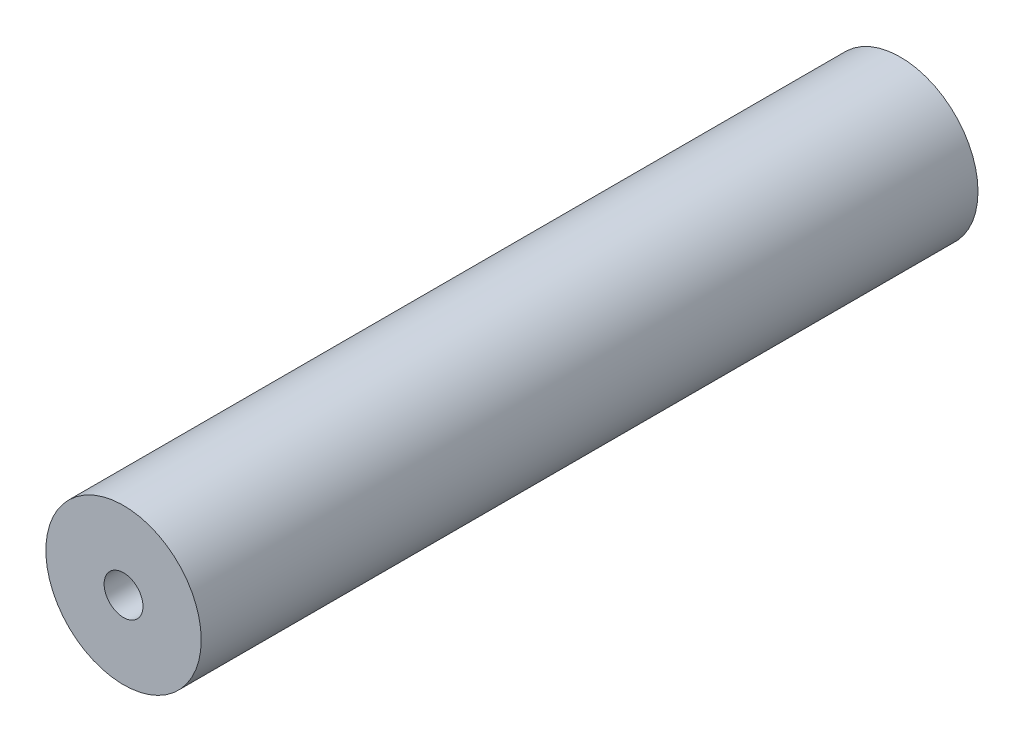
ISO-10303-21;
HEADER;
FILE_DESCRIPTION(('STEP AP214'),'2;1');
FILE_NAME('part.step','',(''),(''),'','','');
FILE_SCHEMA(('AUTOMOTIVE_DESIGN { 1 0 10303 214 1 1 1 1 }'));
ENDSEC;
DATA;
#1=APPLICATION_CONTEXT('core data for automotive mechanical design processes');
#2=APPLICATION_PROTOCOL_DEFINITION('international standard','automotive_design',2000,#1);
#3=PRODUCT_CONTEXT('',#1,'mechanical');
#4=PRODUCT('Part','Part','',(#3));
#5=PRODUCT_RELATED_PRODUCT_CATEGORY('part','',(#4));
#6=PRODUCT_DEFINITION_FORMATION('','',#4);
#7=PRODUCT_DEFINITION_CONTEXT('part definition',#1,'design');
#8=PRODUCT_DEFINITION('design','',#6,#7);
#9=PRODUCT_DEFINITION_SHAPE('','',#8);
#10=(LENGTH_UNIT() NAMED_UNIT(*) SI_UNIT(.MILLI.,.METRE.));
#11=(NAMED_UNIT(*) PLANE_ANGLE_UNIT() SI_UNIT($,.RADIAN.));
#12=(NAMED_UNIT(*) SI_UNIT($,.STERADIAN.) SOLID_ANGLE_UNIT());
#13=UNCERTAINTY_MEASURE_WITH_UNIT(LENGTH_MEASURE(1.E-05),#10,'distance_accuracy_value','');
#14=(GEOMETRIC_REPRESENTATION_CONTEXT(3) GLOBAL_UNCERTAINTY_ASSIGNED_CONTEXT((#13)) GLOBAL_UNIT_ASSIGNED_CONTEXT((#10,
#11,#12)) REPRESENTATION_CONTEXT('',''));
#15=CARTESIAN_POINT('',(0.,0.,0.));
#16=DIRECTION('',(0.,0.,1.));
#17=DIRECTION('',(1.,0.,0.));
#18=AXIS2_PLACEMENT_3D('',#15,#16,#17);
#19=CARTESIAN_POINT('',(0.,0.,200.));
#20=DIRECTION('',(0.,0.,-1.));
#21=DIRECTION('',(-1.,0.,0.));
#22=AXIS2_PLACEMENT_3D('',#19,#20,#21);
#23=CYLINDRICAL_SURFACE('',#22,40.);
#24=CARTESIAN_POINT('',(0.,0.,200.));
#25=DIRECTION('',(0.,0.,1.));
#26=DIRECTION('',(1.,0.,0.));
#27=AXIS2_PLACEMENT_3D('',#24,#25,#26);
#28=CIRCLE('',#27,40.);
#29=CARTESIAN_POINT('',(40.,0.,200.));
#30=VERTEX_POINT('',#29);
#31=EDGE_CURVE('E10',#30,#30,#28,.T.);
#32=ORIENTED_EDGE('',*,*,#31,.F.);
#33=EDGE_LOOP('',(#32));
#34=FACE_BOUND('',#33,.T.);
#35=CARTESIAN_POINT('',(0.,0.,-200.));
#36=DIRECTION('',(0.,0.,1.));
#37=DIRECTION('',(1.,0.,0.));
#38=AXIS2_PLACEMENT_3D('',#35,#36,#37);
#39=CIRCLE('',#38,40.);
#40=CARTESIAN_POINT('',(40.,0.,-200.));
#41=VERTEX_POINT('',#40);
#42=EDGE_CURVE('E40',#41,#41,#39,.T.);
#43=ORIENTED_EDGE('',*,*,#42,.T.);
#44=EDGE_LOOP('',(#43));
#45=FACE_BOUND('',#44,.T.);
#46=ADVANCED_FACE('F37',(#34,#45),#23,.T.);
#47=CARTESIAN_POINT('',(0.,0.,200.));
#48=DIRECTION('',(0.,0.,1.));
#49=DIRECTION('',(1.,0.,0.));
#50=AXIS2_PLACEMENT_3D('',#47,#48,#49);
#51=PLANE('',#50);
#52=CARTESIAN_POINT('',(0.,0.,200.));
#53=DIRECTION('',(0.,0.,1.));
#54=DIRECTION('',(1.,0.,0.));
#55=AXIS2_PLACEMENT_3D('',#52,#53,#54);
#56=CIRCLE('',#55,10.);
#57=CARTESIAN_POINT('',(10.,0.,200.));
#58=VERTEX_POINT('',#57);
#59=EDGE_CURVE('E51',#58,#58,#56,.T.);
#60=ORIENTED_EDGE('',*,*,#59,.F.);
#61=EDGE_LOOP('',(#60));
#62=FACE_BOUND('',#61,.T.);
#63=ORIENTED_EDGE('',*,*,#31,.T.);
#64=EDGE_LOOP('',(#63));
#65=FACE_BOUND('',#64,.T.);
#66=ADVANCED_FACE('F80',(#62,#65),#51,.T.);
#67=CARTESIAN_POINT('',(0.,0.,-200.));
#68=DIRECTION('',(0.,0.,1.));
#69=DIRECTION('',(1.,0.,0.));
#70=AXIS2_PLACEMENT_3D('',#67,#68,#69);
#71=PLANE('',#70);
#72=CARTESIAN_POINT('',(0.,0.,-200.));
#73=DIRECTION('',(0.,0.,-1.));
#74=DIRECTION('',(-1.,0.,0.));
#75=AXIS2_PLACEMENT_3D('',#72,#73,#74);
#76=CIRCLE('',#75,10.);
#77=CARTESIAN_POINT('',(-10.,0.,-200.));
#78=VERTEX_POINT('',#77);
#79=EDGE_CURVE('E59',#78,#78,#76,.T.);
#80=ORIENTED_EDGE('',*,*,#79,.F.);
#81=EDGE_LOOP('',(#80));
#82=FACE_BOUND('',#81,.T.);
#83=ORIENTED_EDGE('',*,*,#42,.F.);
#84=EDGE_LOOP('',(#83));
#85=FACE_BOUND('',#84,.T.);
#86=ADVANCED_FACE('F76',(#82,#85),#71,.F.);
#87=CARTESIAN_POINT('',(0.,0.,80.));
#88=DIRECTION('',(0.,0.,1.));
#89=DIRECTION('',(1.,0.,0.));
#90=AXIS2_PLACEMENT_3D('',#87,#88,#89);
#91=CYLINDRICAL_SURFACE('',#90,10.);
#92=CARTESIAN_POINT('',(0.,0.,80.));
#93=DIRECTION('',(0.,0.,1.));
#94=DIRECTION('',(1.,0.,0.));
#95=AXIS2_PLACEMENT_3D('',#92,#93,#94);
#96=CIRCLE('',#95,10.);
#97=CARTESIAN_POINT('',(10.,0.,80.));
#98=VERTEX_POINT('',#97);
#99=EDGE_CURVE('E49',#98,#98,#96,.T.);
#100=ORIENTED_EDGE('',*,*,#99,.F.);
#101=EDGE_LOOP('',(#100));
#102=FACE_BOUND('',#101,.T.);
#103=ORIENTED_EDGE('',*,*,#59,.T.);
#104=EDGE_LOOP('',(#103));
#105=FACE_BOUND('',#104,.T.);
#106=ADVANCED_FACE('F79',(#102,#105),#91,.F.);
#107=CARTESIAN_POINT('',(0.,0.,80.));
#108=DIRECTION('',(0.,0.,1.));
#109=DIRECTION('',(1.,0.,0.));
#110=AXIS2_PLACEMENT_3D('',#107,#108,#109);
#111=PLANE('',#110);
#112=ORIENTED_EDGE('',*,*,#99,.T.);
#113=EDGE_LOOP('',(#112));
#114=FACE_BOUND('',#113,.T.);
#115=ADVANCED_FACE('F72',(#114),#111,.T.);
#116=CARTESIAN_POINT('',(0.,0.,-80.));
#117=DIRECTION('',(0.,0.,-1.));
#118=DIRECTION('',(-1.,0.,0.));
#119=AXIS2_PLACEMENT_3D('',#116,#117,#118);
#120=CYLINDRICAL_SURFACE('',#119,10.);
#121=CARTESIAN_POINT('',(0.,0.,-80.));
#122=DIRECTION('',(0.,0.,-1.));
#123=DIRECTION('',(-1.,0.,0.));
#124=AXIS2_PLACEMENT_3D('',#121,#122,#123);
#125=CIRCLE('',#124,10.);
#126=CARTESIAN_POINT('',(-10.,0.,-80.));
#127=VERTEX_POINT('',#126);
#128=EDGE_CURVE('E55',#127,#127,#125,.T.);
#129=ORIENTED_EDGE('',*,*,#128,.F.);
#130=EDGE_LOOP('',(#129));
#131=FACE_BOUND('',#130,.T.);
#132=ORIENTED_EDGE('',*,*,#79,.T.);
#133=EDGE_LOOP('',(#132));
#134=FACE_BOUND('',#133,.T.);
#135=ADVANCED_FACE('F69',(#131,#134),#120,.F.);
#136=CARTESIAN_POINT('',(0.,0.,-80.));
#137=DIRECTION('',(0.,0.,-1.));
#138=DIRECTION('',(-1.,0.,0.));
#139=AXIS2_PLACEMENT_3D('',#136,#137,#138);
#140=PLANE('',#139);
#141=ORIENTED_EDGE('',*,*,#128,.T.);
#142=EDGE_LOOP('',(#141));
#143=FACE_BOUND('',#142,.T.);
#144=ADVANCED_FACE('F67',(#143),#140,.T.);
#145=CLOSED_SHELL('',(#46,#66,#86,#106,#115,#135,#144));
#146=MANIFOLD_SOLID_BREP('B2',#145);
#147=ADVANCED_BREP_SHAPE_REPRESENTATION('',(#18,#146),#14);
#148=SHAPE_DEFINITION_REPRESENTATION(#9,#147);
ENDSEC;
END-ISO-10303-21;
